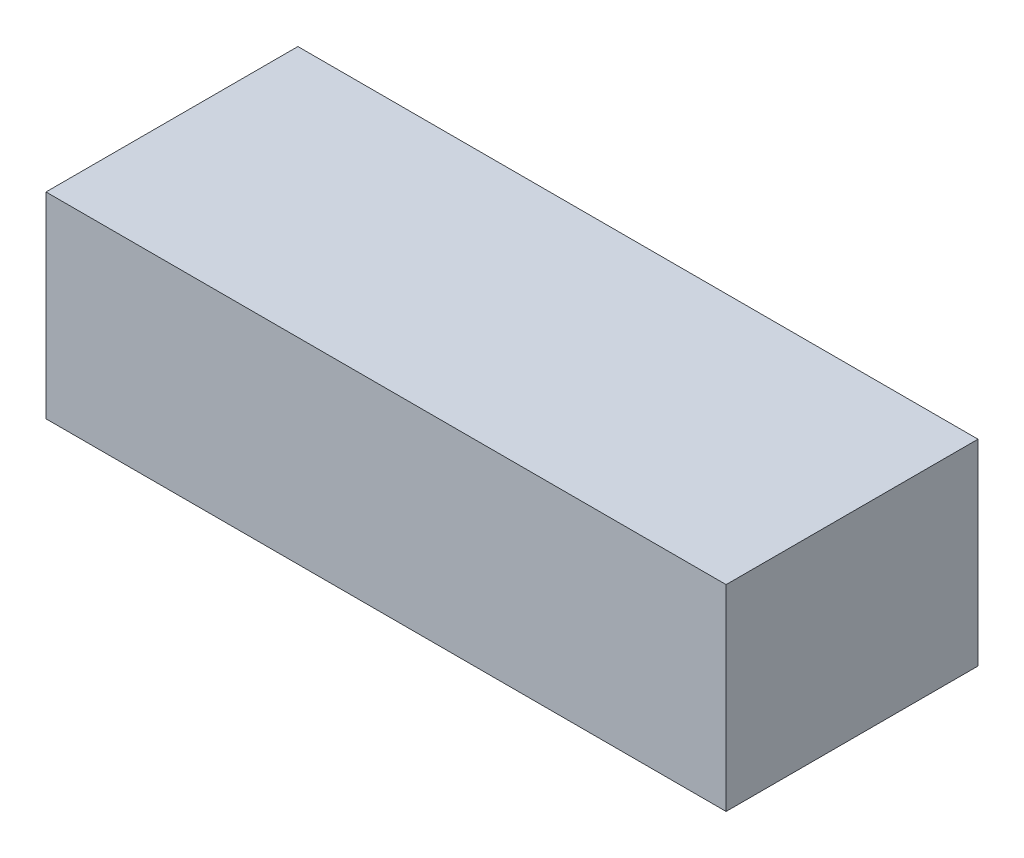
ISO-10303-21;
HEADER;
FILE_DESCRIPTION(('STEP AP214'),'2;1');
FILE_NAME('part.step','',(''),(''),'','','');
FILE_SCHEMA(('AUTOMOTIVE_DESIGN { 1 0 10303 214 1 1 1 1 }'));
ENDSEC;
DATA;
#1=APPLICATION_CONTEXT('core data for automotive mechanical design processes');
#2=APPLICATION_PROTOCOL_DEFINITION('international standard','automotive_design',2000,#1);
#3=PRODUCT_CONTEXT('',#1,'mechanical');
#4=PRODUCT('Part','Part','',(#3));
#5=PRODUCT_RELATED_PRODUCT_CATEGORY('part','',(#4));
#6=PRODUCT_DEFINITION_FORMATION('','',#4);
#7=PRODUCT_DEFINITION_CONTEXT('part definition',#1,'design');
#8=PRODUCT_DEFINITION('design','',#6,#7);
#9=PRODUCT_DEFINITION_SHAPE('','',#8);
#10=(LENGTH_UNIT() NAMED_UNIT(*) SI_UNIT(.MILLI.,.METRE.));
#11=(NAMED_UNIT(*) PLANE_ANGLE_UNIT() SI_UNIT($,.RADIAN.));
#12=(NAMED_UNIT(*) SI_UNIT($,.STERADIAN.) SOLID_ANGLE_UNIT());
#13=UNCERTAINTY_MEASURE_WITH_UNIT(LENGTH_MEASURE(1.E-05),#10,'distance_accuracy_value','');
#14=(GEOMETRIC_REPRESENTATION_CONTEXT(3) GLOBAL_UNCERTAINTY_ASSIGNED_CONTEXT((#13)) GLOBAL_UNIT_ASSIGNED_CONTEXT((#10,
#11,#12)) REPRESENTATION_CONTEXT('',''));
#15=CARTESIAN_POINT('',(0.,0.,0.));
#16=DIRECTION('',(0.,0.,1.));
#17=DIRECTION('',(1.,0.,0.));
#18=AXIS2_PLACEMENT_3D('',#15,#16,#17);
#19=CARTESIAN_POINT('',(135.,-19.5,-25.));
#20=DIRECTION('',(0.,0.,1.));
#21=DIRECTION('',(1.,0.,0.));
#22=AXIS2_PLACEMENT_3D('',#19,#20,#21);
#23=PLANE('',#22);
#24=DIRECTION('',(0.,1.,0.));
#25=VECTOR('',#24,1.);
#26=CARTESIAN_POINT('',(0.,-19.5,-25.));
#27=LINE('',#26,#25);
#28=CARTESIAN_POINT('',(0.,-19.5,-25.));
#29=VERTEX_POINT('',#28);
#30=CARTESIAN_POINT('',(0.,19.5,-25.));
#31=VERTEX_POINT('',#30);
#32=EDGE_CURVE('E104',#29,#31,#27,.T.);
#33=ORIENTED_EDGE('',*,*,#32,.T.);
#34=DIRECTION('',(-1.,0.,0.));
#35=VECTOR('',#34,1.);
#36=CARTESIAN_POINT('',(135.,19.5,-25.));
#37=LINE('',#36,#35);
#38=CARTESIAN_POINT('',(135.,19.5,-25.));
#39=VERTEX_POINT('',#38);
#40=EDGE_CURVE('E11',#39,#31,#37,.T.);
#41=ORIENTED_EDGE('',*,*,#40,.F.);
#42=DIRECTION('',(0.,1.,0.));
#43=VECTOR('',#42,1.);
#44=CARTESIAN_POINT('',(135.,-19.5,-25.));
#45=LINE('',#44,#43);
#46=CARTESIAN_POINT('',(135.,-19.5,-25.));
#47=VERTEX_POINT('',#46);
#48=EDGE_CURVE('E92',#47,#39,#45,.T.);
#49=ORIENTED_EDGE('',*,*,#48,.F.);
#50=DIRECTION('',(-1.,0.,0.));
#51=VECTOR('',#50,1.);
#52=CARTESIAN_POINT('',(135.,-19.5,-25.));
#53=LINE('',#52,#51);
#54=EDGE_CURVE('E100',#47,#29,#53,.T.);
#55=ORIENTED_EDGE('',*,*,#54,.T.);
#56=EDGE_LOOP('',(#33,#41,#49,#55));
#57=FACE_BOUND('',#56,.T.);
#58=ADVANCED_FACE('F41',(#57),#23,.F.);
#59=CARTESIAN_POINT('',(135.,19.5,25.));
#60=DIRECTION('',(0.,-1.,0.));
#61=DIRECTION('',(0.,0.,-1.));
#62=AXIS2_PLACEMENT_3D('',#59,#60,#61);
#63=PLANE('',#62);
#64=DIRECTION('',(0.,0.,1.));
#65=VECTOR('',#64,1.);
#66=CARTESIAN_POINT('',(0.,19.5,25.));
#67=LINE('',#66,#65);
#68=CARTESIAN_POINT('',(0.,19.5,25.));
#69=VERTEX_POINT('',#68);
#70=EDGE_CURVE('E96',#31,#69,#67,.T.);
#71=ORIENTED_EDGE('',*,*,#70,.T.);
#72=DIRECTION('',(-1.,0.,0.));
#73=VECTOR('',#72,1.);
#74=CARTESIAN_POINT('',(135.,19.5,25.));
#75=LINE('',#74,#73);
#76=CARTESIAN_POINT('',(135.,19.5,25.));
#77=VERTEX_POINT('',#76);
#78=EDGE_CURVE('E49',#77,#69,#75,.T.);
#79=ORIENTED_EDGE('',*,*,#78,.F.);
#80=DIRECTION('',(0.,0.,1.));
#81=VECTOR('',#80,1.);
#82=CARTESIAN_POINT('',(135.,19.5,25.));
#83=LINE('',#82,#81);
#84=EDGE_CURVE('E87',#39,#77,#83,.T.);
#85=ORIENTED_EDGE('',*,*,#84,.F.);
#86=ORIENTED_EDGE('',*,*,#40,.T.);
#87=EDGE_LOOP('',(#71,#79,#85,#86));
#88=FACE_BOUND('',#87,.T.);
#89=ADVANCED_FACE('F95',(#88),#63,.F.);
#90=CARTESIAN_POINT('',(135.,-19.5,25.));
#91=DIRECTION('',(0.,0.,-1.));
#92=DIRECTION('',(-1.,0.,0.));
#93=AXIS2_PLACEMENT_3D('',#90,#91,#92);
#94=PLANE('',#93);
#95=DIRECTION('',(0.,-1.,0.));
#96=VECTOR('',#95,1.);
#97=CARTESIAN_POINT('',(0.,-19.5,25.));
#98=LINE('',#97,#96);
#99=CARTESIAN_POINT('',(0.,-19.5,25.));
#100=VERTEX_POINT('',#99);
#101=EDGE_CURVE('E74',#69,#100,#98,.T.);
#102=ORIENTED_EDGE('',*,*,#101,.T.);
#103=DIRECTION('',(-1.,0.,0.));
#104=VECTOR('',#103,1.);
#105=CARTESIAN_POINT('',(135.,-19.5,25.));
#106=LINE('',#105,#104);
#107=CARTESIAN_POINT('',(135.,-19.5,25.));
#108=VERTEX_POINT('',#107);
#109=EDGE_CURVE('E97',#108,#100,#106,.T.);
#110=ORIENTED_EDGE('',*,*,#109,.F.);
#111=DIRECTION('',(0.,-1.,0.));
#112=VECTOR('',#111,1.);
#113=CARTESIAN_POINT('',(135.,-19.5,25.));
#114=LINE('',#113,#112);
#115=EDGE_CURVE('E90',#77,#108,#114,.T.);
#116=ORIENTED_EDGE('',*,*,#115,.F.);
#117=ORIENTED_EDGE('',*,*,#78,.T.);
#118=EDGE_LOOP('',(#102,#110,#116,#117));
#119=FACE_BOUND('',#118,.T.);
#120=ADVANCED_FACE('F98',(#119),#94,.F.);
#121=CARTESIAN_POINT('',(135.,-19.5,25.));
#122=DIRECTION('',(0.,1.,0.));
#123=DIRECTION('',(0.,0.,1.));
#124=AXIS2_PLACEMENT_3D('',#121,#122,#123);
#125=PLANE('',#124);
#126=DIRECTION('',(0.,0.,-1.));
#127=VECTOR('',#126,1.);
#128=CARTESIAN_POINT('',(0.,-19.5,25.));
#129=LINE('',#128,#127);
#130=EDGE_CURVE('E80',#100,#29,#129,.T.);
#131=ORIENTED_EDGE('',*,*,#130,.T.);
#132=ORIENTED_EDGE('',*,*,#54,.F.);
#133=DIRECTION('',(0.,0.,-1.));
#134=VECTOR('',#133,1.);
#135=CARTESIAN_POINT('',(135.,-19.5,25.));
#136=LINE('',#135,#134);
#137=EDGE_CURVE('E57',#108,#47,#136,.T.);
#138=ORIENTED_EDGE('',*,*,#137,.F.);
#139=ORIENTED_EDGE('',*,*,#109,.T.);
#140=EDGE_LOOP('',(#131,#132,#138,#139));
#141=FACE_BOUND('',#140,.T.);
#142=ADVANCED_FACE('F111',(#141),#125,.F.);
#143=CARTESIAN_POINT('',(135.,0.,0.));
#144=DIRECTION('',(-1.,0.,0.));
#145=DIRECTION('',(0.,0.,1.));
#146=AXIS2_PLACEMENT_3D('',#143,#144,#145);
#147=PLANE('',#146);
#148=ORIENTED_EDGE('',*,*,#48,.T.);
#149=ORIENTED_EDGE('',*,*,#84,.T.);
#150=ORIENTED_EDGE('',*,*,#115,.T.);
#151=ORIENTED_EDGE('',*,*,#137,.T.);
#152=EDGE_LOOP('',(#148,#149,#150,#151));
#153=FACE_BOUND('',#152,.T.);
#154=ADVANCED_FACE('F88',(#153),#147,.F.);
#155=CARTESIAN_POINT('',(0.,0.,0.));
#156=DIRECTION('',(-1.,0.,0.));
#157=DIRECTION('',(0.,0.,1.));
#158=AXIS2_PLACEMENT_3D('',#155,#156,#157);
#159=PLANE('',#158);
#160=ORIENTED_EDGE('',*,*,#32,.F.);
#161=ORIENTED_EDGE('',*,*,#130,.F.);
#162=ORIENTED_EDGE('',*,*,#101,.F.);
#163=ORIENTED_EDGE('',*,*,#70,.F.);
#164=EDGE_LOOP('',(#160,#161,#162,#163));
#165=FACE_BOUND('',#164,.T.);
#166=ADVANCED_FACE('F114',(#165),#159,.T.);
#167=CLOSED_SHELL('',(#58,#89,#120,#142,#154,#166));
#168=MANIFOLD_SOLID_BREP('B2',#167);
#169=ADVANCED_BREP_SHAPE_REPRESENTATION('',(#18,#168),#14);
#170=SHAPE_DEFINITION_REPRESENTATION(#9,#169);
ENDSEC;
END-ISO-10303-21;
